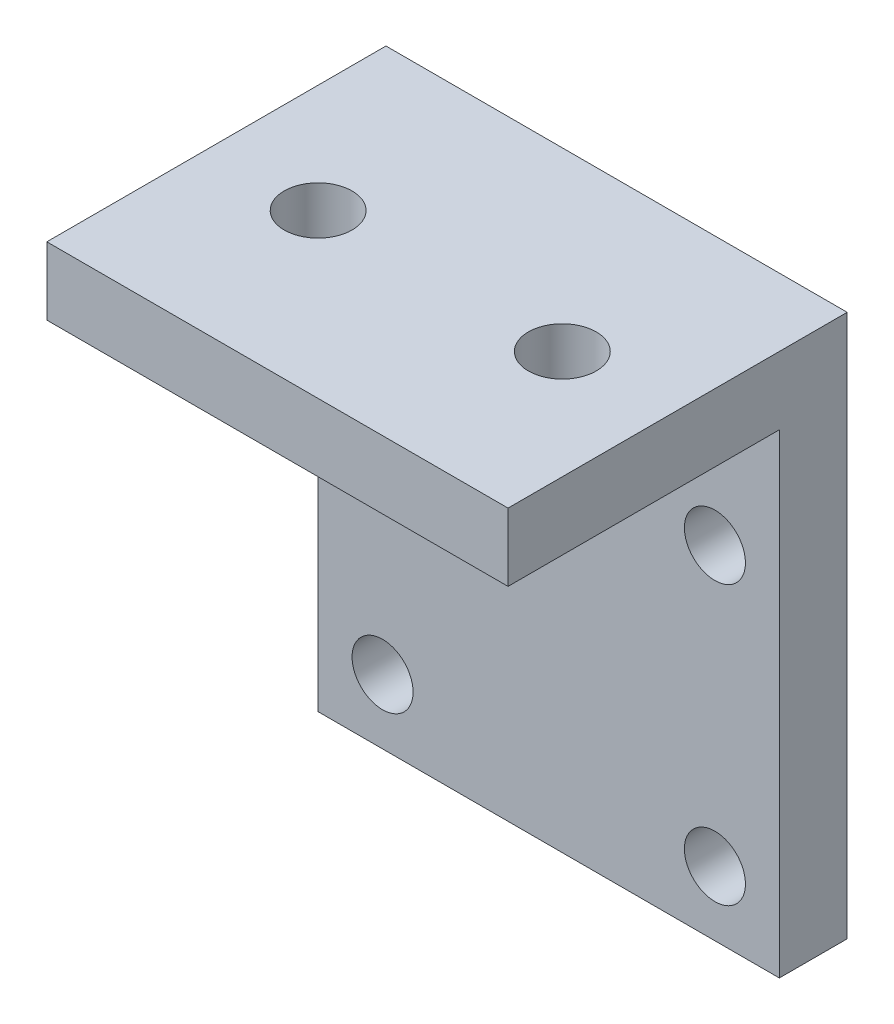
ISO-10303-21;
HEADER;
FILE_DESCRIPTION(('STEP AP214'),'2;1');
FILE_NAME('part.step','',(''),(''),'','','');
FILE_SCHEMA(('AUTOMOTIVE_DESIGN { 1 0 10303 214 1 1 1 1 }'));
ENDSEC;
DATA;
#1=APPLICATION_CONTEXT('core data for automotive mechanical design processes');
#2=APPLICATION_PROTOCOL_DEFINITION('international standard','automotive_design',2000,#1);
#3=PRODUCT_CONTEXT('',#1,'mechanical');
#4=PRODUCT('Part','Part','',(#3));
#5=PRODUCT_RELATED_PRODUCT_CATEGORY('part','',(#4));
#6=PRODUCT_DEFINITION_FORMATION('','',#4);
#7=PRODUCT_DEFINITION_CONTEXT('part definition',#1,'design');
#8=PRODUCT_DEFINITION('design','',#6,#7);
#9=PRODUCT_DEFINITION_SHAPE('','',#8);
#10=(LENGTH_UNIT() NAMED_UNIT(*) SI_UNIT(.MILLI.,.METRE.));
#11=(NAMED_UNIT(*) PLANE_ANGLE_UNIT() SI_UNIT($,.RADIAN.));
#12=(NAMED_UNIT(*) SI_UNIT($,.STERADIAN.) SOLID_ANGLE_UNIT());
#13=UNCERTAINTY_MEASURE_WITH_UNIT(LENGTH_MEASURE(1.E-05),#10,'distance_accuracy_value','');
#14=(GEOMETRIC_REPRESENTATION_CONTEXT(3) GLOBAL_UNCERTAINTY_ASSIGNED_CONTEXT((#13)) GLOBAL_UNIT_ASSIGNED_CONTEXT((#10,
#11,#12)) REPRESENTATION_CONTEXT('',''));
#15=CARTESIAN_POINT('',(0.,0.,0.));
#16=DIRECTION('',(0.,0.,1.));
#17=DIRECTION('',(1.,0.,0.));
#18=AXIS2_PLACEMENT_3D('',#15,#16,#17);
#19=CARTESIAN_POINT('',(0.,0.,5.));
#20=DIRECTION('',(0.,0.,-1.));
#21=DIRECTION('',(-1.,0.,0.));
#22=AXIS2_PLACEMENT_3D('',#19,#20,#21);
#23=PLANE('',#22);
#24=CARTESIAN_POINT('',(4.75,4.75,5.));
#25=DIRECTION('',(0.,0.,1.));
#26=DIRECTION('',(1.,0.,0.));
#27=AXIS2_PLACEMENT_3D('',#24,#25,#26);
#28=CIRCLE('',#27,2.25);
#29=CARTESIAN_POINT('',(7.,4.75,5.));
#30=VERTEX_POINT('',#29);
#31=EDGE_CURVE('E140',#30,#30,#28,.T.);
#32=ORIENTED_EDGE('',*,*,#31,.F.);
#33=EDGE_LOOP('',(#32));
#34=FACE_BOUND('',#33,.T.);
#35=CARTESIAN_POINT('',(29.25,4.75,5.));
#36=DIRECTION('',(0.,0.,1.));
#37=DIRECTION('',(1.,0.,0.));
#38=AXIS2_PLACEMENT_3D('',#35,#36,#37);
#39=CIRCLE('',#38,2.25);
#40=CARTESIAN_POINT('',(31.5,4.75,5.));
#41=VERTEX_POINT('',#40);
#42=EDGE_CURVE('E146',#41,#41,#39,.T.);
#43=ORIENTED_EDGE('',*,*,#42,.F.);
#44=EDGE_LOOP('',(#43));
#45=FACE_BOUND('',#44,.T.);
#46=CARTESIAN_POINT('',(29.25,25.25,5.));
#47=DIRECTION('',(0.,0.,1.));
#48=DIRECTION('',(1.,0.,0.));
#49=AXIS2_PLACEMENT_3D('',#46,#47,#48);
#50=CIRCLE('',#49,2.25);
#51=CARTESIAN_POINT('',(31.5,25.25,5.));
#52=VERTEX_POINT('',#51);
#53=EDGE_CURVE('E152',#52,#52,#50,.T.);
#54=ORIENTED_EDGE('',*,*,#53,.F.);
#55=EDGE_LOOP('',(#54));
#56=FACE_BOUND('',#55,.T.);
#57=CARTESIAN_POINT('',(4.75,25.25,5.));
#58=DIRECTION('',(0.,0.,1.));
#59=DIRECTION('',(1.,0.,0.));
#60=AXIS2_PLACEMENT_3D('',#57,#58,#59);
#61=CIRCLE('',#60,2.25);
#62=CARTESIAN_POINT('',(7.,25.25,5.));
#63=VERTEX_POINT('',#62);
#64=EDGE_CURVE('E158',#63,#63,#61,.T.);
#65=ORIENTED_EDGE('',*,*,#64,.F.);
#66=EDGE_LOOP('',(#65));
#67=FACE_BOUND('',#66,.T.);
#68=DIRECTION('',(1.,0.,0.));
#69=VECTOR('',#68,1.);
#70=CARTESIAN_POINT('',(0.,35.,5.));
#71=LINE('',#70,#69);
#72=CARTESIAN_POINT('',(0.,35.,5.));
#73=VERTEX_POINT('',#72);
#74=CARTESIAN_POINT('',(34.,35.,5.));
#75=VERTEX_POINT('',#74);
#76=EDGE_CURVE('E54',#73,#75,#71,.T.);
#77=ORIENTED_EDGE('',*,*,#76,.F.);
#78=DIRECTION('',(0.,-1.,0.));
#79=VECTOR('',#78,1.);
#80=CARTESIAN_POINT('',(0.,0.,5.));
#81=LINE('',#80,#79);
#82=CARTESIAN_POINT('',(0.,0.,5.));
#83=VERTEX_POINT('',#82);
#84=EDGE_CURVE('E97',#73,#83,#81,.T.);
#85=ORIENTED_EDGE('',*,*,#84,.T.);
#86=DIRECTION('',(1.,0.,0.));
#87=VECTOR('',#86,1.);
#88=CARTESIAN_POINT('',(0.,0.,5.));
#89=LINE('',#88,#87);
#90=CARTESIAN_POINT('',(34.,0.,5.));
#91=VERTEX_POINT('',#90);
#92=EDGE_CURVE('E60',#83,#91,#89,.T.);
#93=ORIENTED_EDGE('',*,*,#92,.T.);
#94=DIRECTION('',(0.,1.,0.));
#95=VECTOR('',#94,1.);
#96=CARTESIAN_POINT('',(34.,0.,5.));
#97=LINE('',#96,#95);
#98=EDGE_CURVE('E90',#91,#75,#97,.T.);
#99=ORIENTED_EDGE('',*,*,#98,.T.);
#100=EDGE_LOOP('',(#77,#85,#93,#99));
#101=FACE_BOUND('',#100,.T.);
#102=ADVANCED_FACE('F37',(#34,#45,#56,#67,#101),#23,.F.);
#103=CARTESIAN_POINT('',(0.,0.,0.));
#104=DIRECTION('',(0.,0.,-1.));
#105=DIRECTION('',(-1.,0.,0.));
#106=AXIS2_PLACEMENT_3D('',#103,#104,#105);
#107=PLANE('',#106);
#108=CARTESIAN_POINT('',(29.25,4.75,0.));
#109=DIRECTION('',(0.,0.,1.));
#110=DIRECTION('',(1.,0.,0.));
#111=AXIS2_PLACEMENT_3D('',#108,#109,#110);
#112=CIRCLE('',#111,2.25);
#113=CARTESIAN_POINT('',(31.5,4.75,0.));
#114=VERTEX_POINT('',#113);
#115=EDGE_CURVE('E143',#114,#114,#112,.T.);
#116=ORIENTED_EDGE('',*,*,#115,.T.);
#117=EDGE_LOOP('',(#116));
#118=FACE_BOUND('',#117,.T.);
#119=CARTESIAN_POINT('',(4.75,25.25,0.));
#120=DIRECTION('',(0.,0.,1.));
#121=DIRECTION('',(1.,0.,0.));
#122=AXIS2_PLACEMENT_3D('',#119,#120,#121);
#123=CIRCLE('',#122,2.25);
#124=CARTESIAN_POINT('',(7.,25.25,0.));
#125=VERTEX_POINT('',#124);
#126=EDGE_CURVE('E155',#125,#125,#123,.T.);
#127=ORIENTED_EDGE('',*,*,#126,.T.);
#128=EDGE_LOOP('',(#127));
#129=FACE_BOUND('',#128,.T.);
#130=DIRECTION('',(0.,-1.,0.));
#131=VECTOR('',#130,1.);
#132=CARTESIAN_POINT('',(0.,0.,0.));
#133=LINE('',#132,#131);
#134=CARTESIAN_POINT('',(0.,40.,0.));
#135=VERTEX_POINT('',#134);
#136=CARTESIAN_POINT('',(0.,0.,0.));
#137=VERTEX_POINT('',#136);
#138=EDGE_CURVE('E81',#135,#137,#133,.T.);
#139=ORIENTED_EDGE('',*,*,#138,.F.);
#140=DIRECTION('',(-1.,0.,0.));
#141=VECTOR('',#140,1.);
#142=CARTESIAN_POINT('',(0.,40.,0.));
#143=LINE('',#142,#141);
#144=CARTESIAN_POINT('',(34.,40.,0.));
#145=VERTEX_POINT('',#144);
#146=EDGE_CURVE('E96',#145,#135,#143,.T.);
#147=ORIENTED_EDGE('',*,*,#146,.F.);
#148=DIRECTION('',(0.,1.,0.));
#149=VECTOR('',#148,1.);
#150=CARTESIAN_POINT('',(34.,0.,0.));
#151=LINE('',#150,#149);
#152=CARTESIAN_POINT('',(34.,0.,0.));
#153=VERTEX_POINT('',#152);
#154=EDGE_CURVE('E80',#153,#145,#151,.T.);
#155=ORIENTED_EDGE('',*,*,#154,.F.);
#156=DIRECTION('',(1.,0.,0.));
#157=VECTOR('',#156,1.);
#158=CARTESIAN_POINT('',(0.,0.,0.));
#159=LINE('',#158,#157);
#160=EDGE_CURVE('E71',#137,#153,#159,.T.);
#161=ORIENTED_EDGE('',*,*,#160,.F.);
#162=EDGE_LOOP('',(#139,#147,#155,#161));
#163=FACE_BOUND('',#162,.T.);
#164=CARTESIAN_POINT('',(29.25,25.25,0.));
#165=DIRECTION('',(0.,0.,1.));
#166=DIRECTION('',(1.,0.,0.));
#167=AXIS2_PLACEMENT_3D('',#164,#165,#166);
#168=CIRCLE('',#167,2.25);
#169=CARTESIAN_POINT('',(31.5,25.25,0.));
#170=VERTEX_POINT('',#169);
#171=EDGE_CURVE('E149',#170,#170,#168,.T.);
#172=ORIENTED_EDGE('',*,*,#171,.T.);
#173=EDGE_LOOP('',(#172));
#174=FACE_BOUND('',#173,.T.);
#175=CARTESIAN_POINT('',(4.75,4.75,0.));
#176=DIRECTION('',(0.,0.,1.));
#177=DIRECTION('',(1.,0.,0.));
#178=AXIS2_PLACEMENT_3D('',#175,#176,#177);
#179=CIRCLE('',#178,2.25);
#180=CARTESIAN_POINT('',(7.,4.75,0.));
#181=VERTEX_POINT('',#180);
#182=EDGE_CURVE('E139',#181,#181,#179,.T.);
#183=ORIENTED_EDGE('',*,*,#182,.T.);
#184=EDGE_LOOP('',(#183));
#185=FACE_BOUND('',#184,.T.);
#186=ADVANCED_FACE('F93',(#118,#129,#163,#174,#185),#107,.T.);
#187=CARTESIAN_POINT('',(0.,0.,5.));
#188=DIRECTION('',(1.,0.,0.));
#189=DIRECTION('',(0.,0.,-1.));
#190=AXIS2_PLACEMENT_3D('',#187,#188,#189);
#191=PLANE('',#190);
#192=ORIENTED_EDGE('',*,*,#138,.T.);
#193=DIRECTION('',(0.,0.,-1.));
#194=VECTOR('',#193,1.);
#195=CARTESIAN_POINT('',(0.,0.,5.));
#196=LINE('',#195,#194);
#197=EDGE_CURVE('E11',#83,#137,#196,.T.);
#198=ORIENTED_EDGE('',*,*,#197,.F.);
#199=ORIENTED_EDGE('',*,*,#84,.F.);
#200=DIRECTION('',(0.,0.,-1.));
#201=VECTOR('',#200,1.);
#202=CARTESIAN_POINT('',(0.,35.,25.));
#203=LINE('',#202,#201);
#204=CARTESIAN_POINT('',(0.,35.,25.));
#205=VERTEX_POINT('',#204);
#206=EDGE_CURVE('E130',#205,#73,#203,.T.);
#207=ORIENTED_EDGE('',*,*,#206,.F.);
#208=DIRECTION('',(0.,-1.,0.));
#209=VECTOR('',#208,1.);
#210=CARTESIAN_POINT('',(0.,40.,25.));
#211=LINE('',#210,#209);
#212=CARTESIAN_POINT('',(0.,40.,25.));
#213=VERTEX_POINT('',#212);
#214=EDGE_CURVE('E115',#213,#205,#211,.T.);
#215=ORIENTED_EDGE('',*,*,#214,.F.);
#216=DIRECTION('',(0.,0.,1.));
#217=VECTOR('',#216,1.);
#218=CARTESIAN_POINT('',(0.,40.,0.));
#219=LINE('',#218,#217);
#220=EDGE_CURVE('E133',#135,#213,#219,.T.);
#221=ORIENTED_EDGE('',*,*,#220,.F.);
#222=EDGE_LOOP('',(#192,#198,#199,#207,#215,#221));
#223=FACE_BOUND('',#222,.T.);
#224=ADVANCED_FACE('F39',(#223),#191,.F.);
#225=CARTESIAN_POINT('',(0.,0.,5.));
#226=DIRECTION('',(0.,1.,0.));
#227=DIRECTION('',(0.,0.,1.));
#228=AXIS2_PLACEMENT_3D('',#225,#226,#227);
#229=PLANE('',#228);
#230=ORIENTED_EDGE('',*,*,#160,.T.);
#231=DIRECTION('',(0.,0.,-1.));
#232=VECTOR('',#231,1.);
#233=CARTESIAN_POINT('',(34.,0.,5.));
#234=LINE('',#233,#232);
#235=EDGE_CURVE('E46',#91,#153,#234,.T.);
#236=ORIENTED_EDGE('',*,*,#235,.F.);
#237=ORIENTED_EDGE('',*,*,#92,.F.);
#238=ORIENTED_EDGE('',*,*,#197,.T.);
#239=EDGE_LOOP('',(#230,#236,#237,#238));
#240=FACE_BOUND('',#239,.T.);
#241=ADVANCED_FACE('F73',(#240),#229,.F.);
#242=CARTESIAN_POINT('',(34.,0.,5.));
#243=DIRECTION('',(-1.,0.,0.));
#244=DIRECTION('',(0.,0.,1.));
#245=AXIS2_PLACEMENT_3D('',#242,#243,#244);
#246=PLANE('',#245);
#247=ORIENTED_EDGE('',*,*,#154,.T.);
#248=DIRECTION('',(0.,0.,-1.));
#249=VECTOR('',#248,1.);
#250=CARTESIAN_POINT('',(34.,40.,0.));
#251=LINE('',#250,#249);
#252=CARTESIAN_POINT('',(34.,40.,25.));
#253=VERTEX_POINT('',#252);
#254=EDGE_CURVE('E136',#253,#145,#251,.T.);
#255=ORIENTED_EDGE('',*,*,#254,.F.);
#256=DIRECTION('',(0.,1.,0.));
#257=VECTOR('',#256,1.);
#258=CARTESIAN_POINT('',(34.,40.,25.));
#259=LINE('',#258,#257);
#260=CARTESIAN_POINT('',(34.,35.,25.));
#261=VERTEX_POINT('',#260);
#262=EDGE_CURVE('E121',#261,#253,#259,.T.);
#263=ORIENTED_EDGE('',*,*,#262,.F.);
#264=DIRECTION('',(0.,0.,-1.));
#265=VECTOR('',#264,1.);
#266=CARTESIAN_POINT('',(34.,35.,25.));
#267=LINE('',#266,#265);
#268=EDGE_CURVE('E127',#261,#75,#267,.T.);
#269=ORIENTED_EDGE('',*,*,#268,.T.);
#270=ORIENTED_EDGE('',*,*,#98,.F.);
#271=ORIENTED_EDGE('',*,*,#235,.T.);
#272=EDGE_LOOP('',(#247,#255,#263,#269,#270,#271));
#273=FACE_BOUND('',#272,.T.);
#274=ADVANCED_FACE('F85',(#273),#246,.F.);
#275=CARTESIAN_POINT('',(4.75,25.25,5.));
#276=DIRECTION('',(0.,0.,-1.));
#277=DIRECTION('',(-1.,0.,0.));
#278=AXIS2_PLACEMENT_3D('',#275,#276,#277);
#279=CYLINDRICAL_SURFACE('',#278,2.25);
#280=ORIENTED_EDGE('',*,*,#64,.T.);
#281=EDGE_LOOP('',(#280));
#282=FACE_BOUND('',#281,.T.);
#283=ORIENTED_EDGE('',*,*,#126,.F.);
#284=EDGE_LOOP('',(#283));
#285=FACE_BOUND('',#284,.T.);
#286=ADVANCED_FACE('F200',(#282,#285),#279,.F.);
#287=CARTESIAN_POINT('',(29.25,25.25,5.));
#288=DIRECTION('',(0.,0.,-1.));
#289=DIRECTION('',(-1.,0.,0.));
#290=AXIS2_PLACEMENT_3D('',#287,#288,#289);
#291=CYLINDRICAL_SURFACE('',#290,2.25);
#292=ORIENTED_EDGE('',*,*,#53,.T.);
#293=EDGE_LOOP('',(#292));
#294=FACE_BOUND('',#293,.T.);
#295=ORIENTED_EDGE('',*,*,#171,.F.);
#296=EDGE_LOOP('',(#295));
#297=FACE_BOUND('',#296,.T.);
#298=ADVANCED_FACE('F301',(#294,#297),#291,.F.);
#299=CARTESIAN_POINT('',(29.25,4.75,5.));
#300=DIRECTION('',(0.,0.,-1.));
#301=DIRECTION('',(-1.,0.,0.));
#302=AXIS2_PLACEMENT_3D('',#299,#300,#301);
#303=CYLINDRICAL_SURFACE('',#302,2.25);
#304=ORIENTED_EDGE('',*,*,#42,.T.);
#305=EDGE_LOOP('',(#304));
#306=FACE_BOUND('',#305,.T.);
#307=ORIENTED_EDGE('',*,*,#115,.F.);
#308=EDGE_LOOP('',(#307));
#309=FACE_BOUND('',#308,.T.);
#310=ADVANCED_FACE('F308',(#306,#309),#303,.F.);
#311=CARTESIAN_POINT('',(4.75,4.75,5.));
#312=DIRECTION('',(0.,0.,-1.));
#313=DIRECTION('',(-1.,0.,0.));
#314=AXIS2_PLACEMENT_3D('',#311,#312,#313);
#315=CYLINDRICAL_SURFACE('',#314,2.25);
#316=ORIENTED_EDGE('',*,*,#31,.T.);
#317=EDGE_LOOP('',(#316));
#318=FACE_BOUND('',#317,.T.);
#319=ORIENTED_EDGE('',*,*,#182,.F.);
#320=EDGE_LOOP('',(#319));
#321=FACE_BOUND('',#320,.T.);
#322=ADVANCED_FACE('F223',(#318,#321),#315,.F.);
#323=CARTESIAN_POINT('',(0.,40.,0.));
#324=DIRECTION('',(0.,1.,0.));
#325=DIRECTION('',(0.,0.,1.));
#326=AXIS2_PLACEMENT_3D('',#323,#324,#325);
#327=PLANE('',#326);
#328=CARTESIAN_POINT('',(8.,40.,13.));
#329=DIRECTION('',(0.,1.,0.));
#330=DIRECTION('',(0.,0.,1.));
#331=AXIS2_PLACEMENT_3D('',#328,#329,#330);
#332=CIRCLE('',#331,2.5);
#333=CARTESIAN_POINT('',(8.,40.,15.5));
#334=VERTEX_POINT('',#333);
#335=EDGE_CURVE('E103',#334,#334,#332,.T.);
#336=ORIENTED_EDGE('',*,*,#335,.F.);
#337=EDGE_LOOP('',(#336));
#338=FACE_BOUND('',#337,.T.);
#339=CARTESIAN_POINT('',(26.,40.,13.));
#340=DIRECTION('',(0.,1.,0.));
#341=DIRECTION('',(0.,0.,1.));
#342=AXIS2_PLACEMENT_3D('',#339,#340,#341);
#343=CIRCLE('',#342,2.5);
#344=CARTESIAN_POINT('',(26.,40.,15.5));
#345=VERTEX_POINT('',#344);
#346=EDGE_CURVE('E108',#345,#345,#343,.T.);
#347=ORIENTED_EDGE('',*,*,#346,.F.);
#348=EDGE_LOOP('',(#347));
#349=FACE_BOUND('',#348,.T.);
#350=ORIENTED_EDGE('',*,*,#220,.T.);
#351=DIRECTION('',(-1.,0.,0.));
#352=VECTOR('',#351,1.);
#353=CARTESIAN_POINT('',(0.,40.,25.));
#354=LINE('',#353,#352);
#355=EDGE_CURVE('E124',#253,#213,#354,.T.);
#356=ORIENTED_EDGE('',*,*,#355,.F.);
#357=ORIENTED_EDGE('',*,*,#254,.T.);
#358=ORIENTED_EDGE('',*,*,#146,.T.);
#359=EDGE_LOOP('',(#350,#356,#357,#358));
#360=FACE_BOUND('',#359,.T.);
#361=ADVANCED_FACE('F168',(#338,#349,#360),#327,.T.);
#362=CARTESIAN_POINT('',(0.,35.,25.));
#363=DIRECTION('',(0.,1.,0.));
#364=DIRECTION('',(0.,0.,1.));
#365=AXIS2_PLACEMENT_3D('',#362,#363,#364);
#366=PLANE('',#365);
#367=CARTESIAN_POINT('',(8.,35.,13.));
#368=DIRECTION('',(0.,1.,0.));
#369=DIRECTION('',(0.,0.,1.));
#370=AXIS2_PLACEMENT_3D('',#367,#368,#369);
#371=CIRCLE('',#370,2.5);
#372=CARTESIAN_POINT('',(8.,35.,15.5));
#373=VERTEX_POINT('',#372);
#374=EDGE_CURVE('E41',#373,#373,#371,.T.);
#375=ORIENTED_EDGE('',*,*,#374,.T.);
#376=EDGE_LOOP('',(#375));
#377=FACE_BOUND('',#376,.T.);
#378=CARTESIAN_POINT('',(26.,35.,13.));
#379=DIRECTION('',(0.,1.,0.));
#380=DIRECTION('',(0.,0.,1.));
#381=AXIS2_PLACEMENT_3D('',#378,#379,#380);
#382=CIRCLE('',#381,2.5);
#383=CARTESIAN_POINT('',(26.,35.,15.5));
#384=VERTEX_POINT('',#383);
#385=EDGE_CURVE('E101',#384,#384,#382,.T.);
#386=ORIENTED_EDGE('',*,*,#385,.T.);
#387=EDGE_LOOP('',(#386));
#388=FACE_BOUND('',#387,.T.);
#389=ORIENTED_EDGE('',*,*,#76,.T.);
#390=ORIENTED_EDGE('',*,*,#268,.F.);
#391=DIRECTION('',(1.,0.,0.));
#392=VECTOR('',#391,1.);
#393=CARTESIAN_POINT('',(0.,35.,25.));
#394=LINE('',#393,#392);
#395=EDGE_CURVE('E118',#205,#261,#394,.T.);
#396=ORIENTED_EDGE('',*,*,#395,.F.);
#397=ORIENTED_EDGE('',*,*,#206,.T.);
#398=EDGE_LOOP('',(#389,#390,#396,#397));
#399=FACE_BOUND('',#398,.T.);
#400=ADVANCED_FACE('F184',(#377,#388,#399),#366,.F.);
#401=CARTESIAN_POINT('',(0.,0.,25.));
#402=DIRECTION('',(0.,0.,1.));
#403=DIRECTION('',(1.,0.,0.));
#404=AXIS2_PLACEMENT_3D('',#401,#402,#403);
#405=PLANE('',#404);
#406=ORIENTED_EDGE('',*,*,#214,.T.);
#407=ORIENTED_EDGE('',*,*,#395,.T.);
#408=ORIENTED_EDGE('',*,*,#262,.T.);
#409=ORIENTED_EDGE('',*,*,#355,.T.);
#410=EDGE_LOOP('',(#406,#407,#408,#409));
#411=FACE_BOUND('',#410,.T.);
#412=ADVANCED_FACE('F177',(#411),#405,.T.);
#413=CARTESIAN_POINT('',(26.,20.,13.));
#414=DIRECTION('',(0.,1.,0.));
#415=DIRECTION('',(0.,0.,1.));
#416=AXIS2_PLACEMENT_3D('',#413,#414,#415);
#417=CYLINDRICAL_SURFACE('',#416,2.5);
#418=ORIENTED_EDGE('',*,*,#346,.T.);
#419=EDGE_LOOP('',(#418));
#420=FACE_BOUND('',#419,.T.);
#421=ORIENTED_EDGE('',*,*,#385,.F.);
#422=EDGE_LOOP('',(#421));
#423=FACE_BOUND('',#422,.T.);
#424=ADVANCED_FACE('F253',(#420,#423),#417,.F.);
#425=CARTESIAN_POINT('',(8.,20.,13.));
#426=DIRECTION('',(0.,1.,0.));
#427=DIRECTION('',(0.,0.,1.));
#428=AXIS2_PLACEMENT_3D('',#425,#426,#427);
#429=CYLINDRICAL_SURFACE('',#428,2.5);
#430=ORIENTED_EDGE('',*,*,#335,.T.);
#431=EDGE_LOOP('',(#430));
#432=FACE_BOUND('',#431,.T.);
#433=ORIENTED_EDGE('',*,*,#374,.F.);
#434=EDGE_LOOP('',(#433));
#435=FACE_BOUND('',#434,.T.);
#436=ADVANCED_FACE('F262',(#432,#435),#429,.F.);
#437=CLOSED_SHELL('',(#102,#186,#224,#241,#274,#286,#298,#310,#322,#361,#400,#412,#424,#436));
#438=MANIFOLD_SOLID_BREP('B2',#437);
#439=ADVANCED_BREP_SHAPE_REPRESENTATION('',(#18,#438),#14);
#440=SHAPE_DEFINITION_REPRESENTATION(#9,#439);
ENDSEC;
END-ISO-10303-21;
